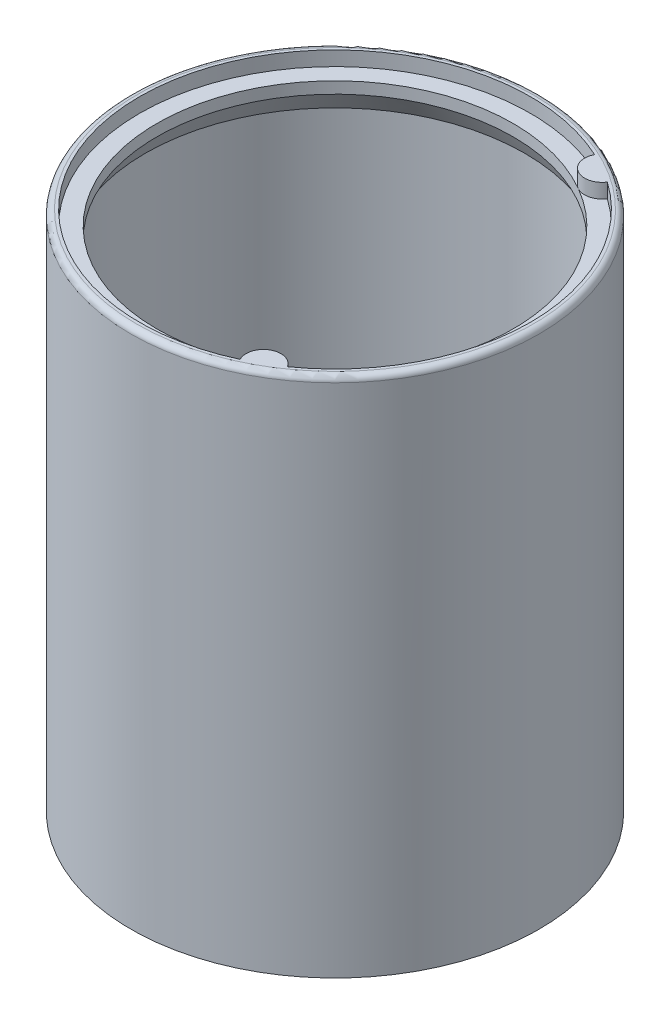
ISO-10303-21;
HEADER;
FILE_DESCRIPTION(('STEP AP214'),'2;1');
FILE_NAME('part.step','',(''),(''),'','','');
FILE_SCHEMA(('AUTOMOTIVE_DESIGN { 1 0 10303 214 1 1 1 1 }'));
ENDSEC;
DATA;
#1=APPLICATION_CONTEXT('core data for automotive mechanical design processes');
#2=APPLICATION_PROTOCOL_DEFINITION('international standard','automotive_design',2000,#1);
#3=PRODUCT_CONTEXT('',#1,'mechanical');
#4=PRODUCT('Part','Part','',(#3));
#5=PRODUCT_RELATED_PRODUCT_CATEGORY('part','',(#4));
#6=PRODUCT_DEFINITION_FORMATION('','',#4);
#7=PRODUCT_DEFINITION_CONTEXT('part definition',#1,'design');
#8=PRODUCT_DEFINITION('design','',#6,#7);
#9=PRODUCT_DEFINITION_SHAPE('','',#8);
#10=(LENGTH_UNIT() NAMED_UNIT(*) SI_UNIT(.MILLI.,.METRE.));
#11=(NAMED_UNIT(*) PLANE_ANGLE_UNIT() SI_UNIT($,.RADIAN.));
#12=(NAMED_UNIT(*) SI_UNIT($,.STERADIAN.) SOLID_ANGLE_UNIT());
#13=UNCERTAINTY_MEASURE_WITH_UNIT(LENGTH_MEASURE(1.E-05),#10,'distance_accuracy_value','');
#14=(GEOMETRIC_REPRESENTATION_CONTEXT(3) GLOBAL_UNCERTAINTY_ASSIGNED_CONTEXT((#13)) GLOBAL_UNIT_ASSIGNED_CONTEXT((#10,
#11,#12)) REPRESENTATION_CONTEXT('',''));
#15=CARTESIAN_POINT('',(0.,0.,0.));
#16=DIRECTION('',(0.,0.,1.));
#17=DIRECTION('',(1.,0.,0.));
#18=AXIS2_PLACEMENT_3D('',#15,#16,#17);
#19=CARTESIAN_POINT('',(0.,87.5,0.));
#20=DIRECTION('',(0.,1.,0.));
#21=DIRECTION('',(0.,0.,1.));
#22=AXIS2_PLACEMENT_3D('',#19,#20,#21);
#23=CYLINDRICAL_SURFACE('',#22,33.75);
#24=CARTESIAN_POINT('',(0.,87.5,0.));
#25=DIRECTION('',(0.,1.,0.));
#26=DIRECTION('',(0.,0.,1.));
#27=AXIS2_PLACEMENT_3D('',#24,#25,#26);
#28=CIRCLE('',#27,33.75);
#29=CARTESIAN_POINT('',(19.4038422750758,87.5,27.6143695376878));
#30=VERTEX_POINT('',#29);
#31=CARTESIAN_POINT('',(19.4038422750762,87.5,-27.6143695376875));
#32=VERTEX_POINT('',#31);
#33=EDGE_CURVE('E101',#30,#32,#28,.T.);
#34=ORIENTED_EDGE('',*,*,#33,.F.);
#35=DIRECTION('',(0.,-1.,0.));
#36=VECTOR('',#35,1.);
#37=CARTESIAN_POINT('',(19.4038422750758,90.,27.6143695376878));
#38=LINE('',#37,#36);
#39=CARTESIAN_POINT('',(19.4038422750758,90.,27.6143695376878));
#40=VERTEX_POINT('',#39);
#41=EDGE_CURVE('E58',#40,#30,#38,.T.);
#42=ORIENTED_EDGE('',*,*,#41,.F.);
#43=CARTESIAN_POINT('',(0.,90.,0.));
#44=DIRECTION('',(0.,1.,0.));
#45=DIRECTION('',(0.,0.,1.));
#46=AXIS2_PLACEMENT_3D('',#43,#44,#45);
#47=CIRCLE('',#46,33.75);
#48=CARTESIAN_POINT('',(19.4038422750762,90.,-27.6143695376875));
#49=VERTEX_POINT('',#48);
#50=EDGE_CURVE('E133',#40,#49,#47,.T.);
#51=ORIENTED_EDGE('',*,*,#50,.T.);
#52=DIRECTION('',(0.,-1.,0.));
#53=VECTOR('',#52,1.);
#54=CARTESIAN_POINT('',(19.4038422750762,90.,-27.6143695376875));
#55=LINE('',#54,#53);
#56=EDGE_CURVE('E127',#49,#32,#55,.T.);
#57=ORIENTED_EDGE('',*,*,#56,.T.);
#58=EDGE_LOOP('',(#34,#42,#51,#57));
#59=FACE_BOUND('',#58,.T.);
#60=ADVANCED_FACE('F43',(#59),#23,.F.);
#61=CARTESIAN_POINT('',(0.,87.5,0.));
#62=DIRECTION('',(0.,1.,0.));
#63=DIRECTION('',(0.,0.,1.));
#64=AXIS2_PLACEMENT_3D('',#61,#62,#63);
#65=PLANE('',#64);
#66=CARTESIAN_POINT('',(16.8749999999997,87.5,29.228357377725));
#67=DIRECTION('',(0.,1.,0.));
#68=DIRECTION('',(0.,0.,1.));
#69=AXIS2_PLACEMENT_3D('',#66,#67,#68);
#70=CIRCLE('',#69,3.);
#71=CARTESIAN_POINT('',(15.3749999999998,87.5,26.6302811663716));
#72=VERTEX_POINT('',#71);
#73=EDGE_CURVE('E111',#72,#30,#70,.F.);
#74=ORIENTED_EDGE('',*,*,#73,.T.);
#75=ORIENTED_EDGE('',*,*,#33,.T.);
#76=CARTESIAN_POINT('',(16.8750000000001,87.5,-29.2283573777247));
#77=DIRECTION('',(0.,1.,0.));
#78=DIRECTION('',(0.,0.,1.));
#79=AXIS2_PLACEMENT_3D('',#76,#77,#78);
#80=CIRCLE('',#79,3.);
#81=CARTESIAN_POINT('',(15.3750000000001,87.5,-26.6302811663714));
#82=VERTEX_POINT('',#81);
#83=EDGE_CURVE('E123',#32,#82,#80,.F.);
#84=ORIENTED_EDGE('',*,*,#83,.T.);
#85=CARTESIAN_POINT('',(0.,87.5,0.));
#86=DIRECTION('',(0.,1.,0.));
#87=DIRECTION('',(0.,0.,1.));
#88=AXIS2_PLACEMENT_3D('',#85,#86,#87);
#89=CIRCLE('',#88,30.75);
#90=EDGE_CURVE('E130',#72,#82,#89,.T.);
#91=ORIENTED_EDGE('',*,*,#90,.F.);
#92=EDGE_LOOP('',(#74,#75,#84,#91));
#93=FACE_BOUND('',#92,.T.);
#94=ADVANCED_FACE('F184',(#93),#65,.T.);
#95=CARTESIAN_POINT('',(0.,90.,0.));
#96=DIRECTION('',(0.,-1.,0.));
#97=DIRECTION('',(0.,0.,-1.));
#98=AXIS2_PLACEMENT_3D('',#95,#96,#97);
#99=CYLINDRICAL_SURFACE('',#98,35.25);
#100=CARTESIAN_POINT('',(0.,89.,0.));
#101=DIRECTION('',(0.,1.,0.));
#102=DIRECTION('',(0.,0.,1.));
#103=AXIS2_PLACEMENT_3D('',#100,#101,#102);
#104=CIRCLE('',#103,35.25);
#105=CARTESIAN_POINT('',(0.,89.,-35.25));
#106=VERTEX_POINT('',#105);
#107=EDGE_CURVE('E141',#106,#106,#104,.F.);
#108=CARTESIAN_POINT('',(0.,0.,0.));
#109=DIRECTION('',(0.,1.,0.));
#110=DIRECTION('',(0.,0.,1.));
#111=AXIS2_PLACEMENT_3D('',#108,#109,#110);
#112=CIRCLE('',#111,35.25);
#113=CARTESIAN_POINT('',(0.,0.,-35.25));
#114=VERTEX_POINT('',#113);
#115=EDGE_CURVE('E100',#114,#114,#112,.T.);
#116=CARTESIAN_POINT('',(0.,89.,-35.25));
#117=CARTESIAN_POINT('',(0.,88.0729166666667,-35.25));
#118=CARTESIAN_POINT('',(0.,87.1458333333333,-35.25));
#119=CARTESIAN_POINT('',(0.,85.2916666666667,-35.25));
#120=CARTESIAN_POINT('',(0.,84.3645833333333,-35.25));
#121=CARTESIAN_POINT('',(0.,82.5104166666667,-35.25));
#122=CARTESIAN_POINT('',(0.,81.5833333333333,-35.25));
#123=CARTESIAN_POINT('',(0.,79.7291666666667,-35.25));
#124=CARTESIAN_POINT('',(0.,78.8020833333333,-35.25));
#125=CARTESIAN_POINT('',(0.,76.9479166666667,-35.25));
#126=CARTESIAN_POINT('',(0.,76.0208333333333,-35.25));
#127=CARTESIAN_POINT('',(0.,74.1666666666667,-35.25));
#128=CARTESIAN_POINT('',(0.,73.2395833333333,-35.25));
#129=CARTESIAN_POINT('',(0.,71.3854166666667,-35.25));
#130=CARTESIAN_POINT('',(0.,70.4583333333333,-35.25));
#131=CARTESIAN_POINT('',(0.,68.6041666666667,-35.25));
#132=CARTESIAN_POINT('',(0.,67.6770833333333,-35.25));
#133=CARTESIAN_POINT('',(0.,65.8229166666667,-35.25));
#134=CARTESIAN_POINT('',(0.,64.8958333333333,-35.25));
#135=CARTESIAN_POINT('',(0.,63.0416666666667,-35.25));
#136=CARTESIAN_POINT('',(0.,62.1145833333333,-35.25));
#137=CARTESIAN_POINT('',(0.,60.2604166666667,-35.25));
#138=CARTESIAN_POINT('',(0.,59.3333333333333,-35.25));
#139=CARTESIAN_POINT('',(0.,57.4791666666667,-35.25));
#140=CARTESIAN_POINT('',(0.,56.5520833333333,-35.25));
#141=CARTESIAN_POINT('',(0.,54.6979166666667,-35.25));
#142=CARTESIAN_POINT('',(0.,53.7708333333333,-35.25));
#143=CARTESIAN_POINT('',(0.,51.9166666666667,-35.25));
#144=CARTESIAN_POINT('',(0.,50.9895833333333,-35.25));
#145=CARTESIAN_POINT('',(0.,49.1354166666667,-35.25));
#146=CARTESIAN_POINT('',(0.,48.2083333333333,-35.25));
#147=CARTESIAN_POINT('',(0.,46.3541666666667,-35.25));
#148=CARTESIAN_POINT('',(0.,45.4270833333333,-35.25));
#149=CARTESIAN_POINT('',(0.,43.5729166666667,-35.25));
#150=CARTESIAN_POINT('',(0.,42.6458333333333,-35.25));
#151=CARTESIAN_POINT('',(0.,40.7916666666667,-35.25));
#152=CARTESIAN_POINT('',(0.,39.8645833333333,-35.25));
#153=CARTESIAN_POINT('',(0.,38.0104166666667,-35.25));
#154=CARTESIAN_POINT('',(0.,37.0833333333333,-35.25));
#155=CARTESIAN_POINT('',(0.,35.2291666666667,-35.25));
#156=CARTESIAN_POINT('',(0.,34.3020833333333,-35.25));
#157=CARTESIAN_POINT('',(0.,32.4479166666667,-35.25));
#158=CARTESIAN_POINT('',(0.,31.5208333333333,-35.25));
#159=CARTESIAN_POINT('',(0.,29.6666666666667,-35.25));
#160=CARTESIAN_POINT('',(0.,28.7395833333333,-35.25));
#161=CARTESIAN_POINT('',(0.,26.8854166666667,-35.25));
#162=CARTESIAN_POINT('',(0.,25.9583333333333,-35.25));
#163=CARTESIAN_POINT('',(0.,24.1041666666667,-35.25));
#164=CARTESIAN_POINT('',(0.,23.1770833333333,-35.25));
#165=CARTESIAN_POINT('',(0.,21.3229166666667,-35.25));
#166=CARTESIAN_POINT('',(0.,20.3958333333333,-35.25));
#167=CARTESIAN_POINT('',(0.,18.5416666666667,-35.25));
#168=CARTESIAN_POINT('',(0.,17.6145833333333,-35.25));
#169=CARTESIAN_POINT('',(0.,15.7604166666667,-35.25));
#170=CARTESIAN_POINT('',(0.,14.8333333333333,-35.25));
#171=CARTESIAN_POINT('',(0.,12.9791666666666,-35.25));
#172=CARTESIAN_POINT('',(0.,12.0520833333333,-35.25));
#173=CARTESIAN_POINT('',(0.,10.1979166666666,-35.25));
#174=CARTESIAN_POINT('',(0.,9.27083333333332,-35.25));
#175=CARTESIAN_POINT('',(0.,7.41666666666665,-35.25));
#176=CARTESIAN_POINT('',(0.,6.48958333333332,-35.25));
#177=CARTESIAN_POINT('',(0.,4.63541666666665,-35.25));
#178=CARTESIAN_POINT('',(0.,3.70833333333332,-35.25));
#179=CARTESIAN_POINT('',(0.,1.85416666666665,-35.25));
#180=CARTESIAN_POINT('',(0.,0.92708333333332,-35.25));
#181=CARTESIAN_POINT('',(0.,0.,-35.25));
#182=B_SPLINE_CURVE_WITH_KNOTS('',3,(#116,#117,#118,#119,#120,#121,#122,#123,#124,#125,#126,
#127,#128,#129,#130,#131,#132,#133,#134,#135,#136,#137,#138,#139,#140,#141,#142,#143,#144,#145,
#146,#147,#148,#149,#150,#151,#152,#153,#154,#155,#156,#157,#158,#159,#160,#161,#162,#163,#164,
#165,#166,#167,#168,#169,#170,#171,#172,#173,#174,#175,#176,#177,#178,#179,#180,#181),
.UNSPECIFIED.,.F.,.F.,(4,2,2,2,2,2,2,2,2,2,2,2,2,2,2,2,2,2,2,2,2,2,2,2,2,2,2,2,2,2,2,2,4),(0.,
2.78125,5.5625,8.34375,11.125,13.90625,16.6875,19.46875,22.25,25.03125,27.8125,30.59375,33.375,
36.15625,38.9375,41.71875,44.5,47.28125,50.0625,52.84375,55.625,58.40625,61.1875,63.96875,66.75,
69.53125,72.3125,75.09375,77.875,80.65625,83.4375,86.21875,89.),.UNSPECIFIED.);
#183=EDGE_CURVE('BSEAM189',#106,#114,#182,.T.);
#184=ORIENTED_EDGE('',*,*,#107,.T.);
#185=ORIENTED_EDGE('',*,*,#115,.T.);
#186=ORIENTED_EDGE('',*,*,#183,.T.);
#187=ORIENTED_EDGE('',*,*,#183,.F.);
#188=EDGE_LOOP('',(#184,#186,#185,#187));
#189=FACE_BOUND('',#188,.T.);
#190=ADVANCED_FACE('F189',(#189),#99,.T.);
#191=CARTESIAN_POINT('',(0.,90.,0.));
#192=DIRECTION('',(0.,1.,0.));
#193=DIRECTION('',(0.,0.,1.));
#194=AXIS2_PLACEMENT_3D('',#191,#192,#193);
#195=PLANE('',#194);
#196=CARTESIAN_POINT('',(14.2128243915907,90.,-30.6114051100861));
#197=VERTEX_POINT('',#196);
#198=CARTESIAN_POINT('',(14.2128243915903,90.,30.6114051100863));
#199=VERTEX_POINT('',#198);
#200=EDGE_CURVE('E66',#197,#199,#47,.T.);
#201=ORIENTED_EDGE('',*,*,#200,.F.);
#202=CARTESIAN_POINT('',(16.8750000000001,90.,-29.2283573777247));
#203=DIRECTION('',(0.,1.,0.));
#204=DIRECTION('',(0.,0.,1.));
#205=AXIS2_PLACEMENT_3D('',#202,#203,#204);
#206=CIRCLE('',#205,3.);
#207=EDGE_CURVE('E119',#49,#197,#206,.F.);
#208=ORIENTED_EDGE('',*,*,#207,.F.);
#209=ORIENTED_EDGE('',*,*,#50,.F.);
#210=CARTESIAN_POINT('',(16.8749999999997,90.,29.228357377725));
#211=DIRECTION('',(0.,1.,0.));
#212=DIRECTION('',(0.,0.,1.));
#213=AXIS2_PLACEMENT_3D('',#210,#211,#212);
#214=CIRCLE('',#213,3.);
#215=EDGE_CURVE('E112',#199,#40,#214,.F.);
#216=ORIENTED_EDGE('',*,*,#215,.F.);
#217=EDGE_LOOP('',(#201,#208,#209,#216));
#218=FACE_BOUND('',#217,.T.);
#219=CARTESIAN_POINT('',(0.,90.,0.));
#220=DIRECTION('',(0.,1.,0.));
#221=DIRECTION('',(0.,0.,1.));
#222=AXIS2_PLACEMENT_3D('',#219,#220,#221);
#223=CIRCLE('',#222,34.25);
#224=CARTESIAN_POINT('',(0.,90.,34.25));
#225=VERTEX_POINT('',#224);
#226=EDGE_CURVE('E138',#225,#225,#223,.T.);
#227=ORIENTED_EDGE('',*,*,#226,.T.);
#228=EDGE_LOOP('',(#227));
#229=FACE_BOUND('',#228,.T.);
#230=ADVANCED_FACE('F206',(#218,#229),#195,.T.);
#231=CARTESIAN_POINT('',(0.,0.,0.));
#232=DIRECTION('',(0.,1.,0.));
#233=DIRECTION('',(0.,0.,1.));
#234=AXIS2_PLACEMENT_3D('',#231,#232,#233);
#235=PLANE('',#234);
#236=CARTESIAN_POINT('',(0.,0.,0.));
#237=DIRECTION('',(0.,-1.,0.));
#238=DIRECTION('',(0.,0.,-1.));
#239=AXIS2_PLACEMENT_3D('',#236,#237,#238);
#240=CIRCLE('',#239,3.2);
#241=CARTESIAN_POINT('',(0.,0.,-3.2));
#242=VERTEX_POINT('',#241);
#243=EDGE_CURVE('E153',#242,#242,#240,.T.);
#244=ORIENTED_EDGE('',*,*,#243,.F.);
#245=EDGE_LOOP('',(#244));
#246=FACE_BOUND('',#245,.T.);
#247=ORIENTED_EDGE('',*,*,#115,.F.);
#248=EDGE_LOOP('',(#247));
#249=FACE_BOUND('',#248,.T.);
#250=ADVANCED_FACE('F200',(#246,#249),#235,.F.);
#251=CARTESIAN_POINT('',(0.,89.,0.));
#252=DIRECTION('',(0.,1.,0.));
#253=DIRECTION('',(0.,0.,1.));
#254=AXIS2_PLACEMENT_3D('',#251,#252,#253);
#255=TOROIDAL_SURFACE('',#254,34.25,1.);
#256=ORIENTED_EDGE('',*,*,#107,.F.);
#257=EDGE_LOOP('',(#256));
#258=FACE_BOUND('',#257,.T.);
#259=ORIENTED_EDGE('',*,*,#226,.F.);
#260=EDGE_LOOP('',(#259));
#261=FACE_BOUND('',#260,.T.);
#262=ADVANCED_FACE('F194',(#258,#261),#255,.T.);
#263=ORIENTED_EDGE('',*,*,#200,.T.);
#264=DIRECTION('',(0.,-1.,0.));
#265=VECTOR('',#264,1.);
#266=CARTESIAN_POINT('',(14.2128243915903,90.,30.6114051100863));
#267=LINE('',#266,#265);
#268=CARTESIAN_POINT('',(14.2128243915903,87.5,30.6114051100863));
#269=VERTEX_POINT('',#268);
#270=EDGE_CURVE('E103',#199,#269,#267,.T.);
#271=ORIENTED_EDGE('',*,*,#270,.T.);
#272=CARTESIAN_POINT('',(14.2128243915907,87.5,-30.6114051100861));
#273=VERTEX_POINT('',#272);
#274=EDGE_CURVE('E91',#273,#269,#28,.T.);
#275=ORIENTED_EDGE('',*,*,#274,.F.);
#276=DIRECTION('',(0.,-1.,0.));
#277=VECTOR('',#276,1.);
#278=CARTESIAN_POINT('',(14.2128243915907,90.,-30.6114051100861));
#279=LINE('',#278,#277);
#280=EDGE_CURVE('E122',#197,#273,#279,.T.);
#281=ORIENTED_EDGE('',*,*,#280,.F.);
#282=EDGE_LOOP('',(#263,#271,#275,#281));
#283=FACE_BOUND('',#282,.T.);
#284=ADVANCED_FACE('F104',(#283),#23,.F.);
#285=EDGE_CURVE('E95',#269,#72,#70,.F.);
#286=ORIENTED_EDGE('',*,*,#285,.T.);
#287=EDGE_CURVE('E131',#82,#72,#89,.T.);
#288=ORIENTED_EDGE('',*,*,#287,.F.);
#289=EDGE_CURVE('E98',#82,#273,#80,.F.);
#290=ORIENTED_EDGE('',*,*,#289,.T.);
#291=ORIENTED_EDGE('',*,*,#274,.T.);
#292=EDGE_LOOP('',(#286,#288,#290,#291));
#293=FACE_BOUND('',#292,.T.);
#294=ADVANCED_FACE('F92',(#293),#65,.T.);
#295=CARTESIAN_POINT('',(0.,77.5,0.));
#296=DIRECTION('',(0.,1.,0.));
#297=DIRECTION('',(0.,0.,1.));
#298=AXIS2_PLACEMENT_3D('',#295,#296,#297);
#299=CYLINDRICAL_SURFACE('',#298,30.75);
#300=CARTESIAN_POINT('',(0.,85.5,0.));
#301=DIRECTION('',(0.,1.,0.));
#302=DIRECTION('',(0.,0.,1.));
#303=AXIS2_PLACEMENT_3D('',#300,#301,#302);
#304=CIRCLE('',#303,30.75);
#305=CARTESIAN_POINT('',(0.,85.5,30.75));
#306=VERTEX_POINT('',#305);
#307=EDGE_CURVE('E144',#306,#306,#304,.F.);
#308=ORIENTED_EDGE('',*,*,#307,.T.);
#309=EDGE_LOOP('',(#308));
#310=FACE_BOUND('',#309,.T.);
#311=ORIENTED_EDGE('',*,*,#287,.T.);
#312=ORIENTED_EDGE('',*,*,#90,.T.);
#313=EDGE_LOOP('',(#311,#312));
#314=FACE_BOUND('',#313,.T.);
#315=ADVANCED_FACE('F199',(#310,#314),#299,.F.);
#316=CARTESIAN_POINT('',(0.,3.49999999999999,0.));
#317=DIRECTION('',(0.,1.,0.));
#318=DIRECTION('',(0.,0.,1.));
#319=AXIS2_PLACEMENT_3D('',#316,#317,#318);
#320=PLANE('',#319);
#321=CARTESIAN_POINT('',(0.,3.49999999999999,0.));
#322=DIRECTION('',(0.,1.,0.));
#323=DIRECTION('',(0.,0.,1.));
#324=AXIS2_PLACEMENT_3D('',#321,#322,#323);
#325=CIRCLE('',#324,7.7);
#326=CARTESIAN_POINT('',(0.,3.49999999999999,7.7));
#327=VERTEX_POINT('',#326);
#328=EDGE_CURVE('E162',#327,#327,#325,.F.);
#329=ORIENTED_EDGE('',*,*,#328,.T.);
#330=EDGE_LOOP('',(#329));
#331=FACE_BOUND('',#330,.T.);
#332=CARTESIAN_POINT('',(0.,3.49999999999999,0.));
#333=DIRECTION('',(0.,1.,0.));
#334=DIRECTION('',(0.,0.,1.));
#335=AXIS2_PLACEMENT_3D('',#332,#333,#334);
#336=CIRCLE('',#335,31.25);
#337=CARTESIAN_POINT('',(0.,3.49999999999999,31.25));
#338=VERTEX_POINT('',#337);
#339=EDGE_CURVE('E159',#338,#338,#336,.T.);
#340=ORIENTED_EDGE('',*,*,#339,.T.);
#341=EDGE_LOOP('',(#340));
#342=FACE_BOUND('',#341,.T.);
#343=ADVANCED_FACE('F228',(#331,#342),#320,.T.);
#344=CARTESIAN_POINT('',(0.,3.49999999999999,0.));
#345=DIRECTION('',(0.,1.,0.));
#346=DIRECTION('',(0.,0.,1.));
#347=AXIS2_PLACEMENT_3D('',#344,#345,#346);
#348=CYLINDRICAL_SURFACE('',#347,32.75);
#349=CARTESIAN_POINT('',(0.,4.99999999999999,0.));
#350=DIRECTION('',(0.,1.,0.));
#351=DIRECTION('',(0.,0.,1.));
#352=AXIS2_PLACEMENT_3D('',#349,#350,#351);
#353=CIRCLE('',#352,32.75);
#354=CARTESIAN_POINT('',(0.,4.99999999999999,32.75));
#355=VERTEX_POINT('',#354);
#356=EDGE_CURVE('E11',#355,#355,#353,.F.);
#357=CARTESIAN_POINT('',(0.,82.0358983848623,0.));
#358=DIRECTION('',(0.,-1.,0.));
#359=DIRECTION('',(0.,0.,-1.));
#360=AXIS2_PLACEMENT_3D('',#357,#358,#359);
#361=CIRCLE('',#360,32.75);
#362=CARTESIAN_POINT('',(0.,82.0358983848624,32.75));
#363=VERTEX_POINT('',#362);
#364=EDGE_CURVE('E147',#363,#363,#361,.F.);
#365=CARTESIAN_POINT('',(0.,4.99999999999999,32.75));
#366=CARTESIAN_POINT('',(0.,5.8024572748423,32.75));
#367=CARTESIAN_POINT('',(0.,6.60491454968462,32.75));
#368=CARTESIAN_POINT('',(0.,8.20982909936926,32.75));
#369=CARTESIAN_POINT('',(0.,9.01228637421157,32.75));
#370=CARTESIAN_POINT('',(0.,10.6172009238962,32.75));
#371=CARTESIAN_POINT('',(0.,11.4196581987385,32.75));
#372=CARTESIAN_POINT('',(0.,13.0245727484232,32.75));
#373=CARTESIAN_POINT('',(0.,13.8270300232655,32.75));
#374=CARTESIAN_POINT('',(0.,15.4319445729501,32.75));
#375=CARTESIAN_POINT('',(0.,16.2344018477924,32.75));
#376=CARTESIAN_POINT('',(0.,17.839316397477,32.75));
#377=CARTESIAN_POINT('',(0.,18.6417736723194,32.75));
#378=CARTESIAN_POINT('',(0.,20.246688222004,32.75));
#379=CARTESIAN_POINT('',(0.,21.0491454968463,32.75));
#380=CARTESIAN_POINT('',(0.,22.6540600465309,32.75));
#381=CARTESIAN_POINT('',(0.,23.4565173213733,32.75));
#382=CARTESIAN_POINT('',(0.,25.0614318710579,32.75));
#383=CARTESIAN_POINT('',(0.,25.8638891459002,32.75));
#384=CARTESIAN_POINT('',(0.,27.4688036955848,32.75));
#385=CARTESIAN_POINT('',(0.,28.2712609704272,32.75));
#386=CARTESIAN_POINT('',(0.,29.8761755201118,32.75));
#387=CARTESIAN_POINT('',(0.,30.6786327949541,32.75));
#388=CARTESIAN_POINT('',(0.,32.2835473446387,32.75));
#389=CARTESIAN_POINT('',(0.,33.0860046194811,32.75));
#390=CARTESIAN_POINT('',(0.,34.6909191691657,32.75));
#391=CARTESIAN_POINT('',(0.,35.493376444008,32.75));
#392=CARTESIAN_POINT('',(0.,37.0982909936926,32.75));
#393=CARTESIAN_POINT('',(0.,37.900748268535,32.75));
#394=CARTESIAN_POINT('',(0.,39.5056628182196,32.75));
#395=CARTESIAN_POINT('',(0.,40.3081200930619,32.75));
#396=CARTESIAN_POINT('',(0.,41.9130346427465,32.75));
#397=CARTESIAN_POINT('',(0.,42.7154919175889,32.75));
#398=CARTESIAN_POINT('',(0.,44.3204064672735,32.75));
#399=CARTESIAN_POINT('',(0.,45.1228637421158,32.75));
#400=CARTESIAN_POINT('',(0.,46.7277782918004,32.75));
#401=CARTESIAN_POINT('',(0.,47.5302355666428,32.75));
#402=CARTESIAN_POINT('',(0.,49.1351501163274,32.75));
#403=CARTESIAN_POINT('',(0.,49.9376073911697,32.75));
#404=CARTESIAN_POINT('',(0.,51.5425219408543,32.75));
#405=CARTESIAN_POINT('',(0.,52.3449792156967,32.75));
#406=CARTESIAN_POINT('',(0.,53.9498937653813,32.75));
#407=CARTESIAN_POINT('',(0.,54.7523510402236,32.75));
#408=CARTESIAN_POINT('',(0.,56.3572655899082,32.75));
#409=CARTESIAN_POINT('',(0.,57.1597228647506,32.75));
#410=CARTESIAN_POINT('',(0.,58.7646374144352,32.75));
#411=CARTESIAN_POINT('',(0.,59.5670946892775,32.75));
#412=CARTESIAN_POINT('',(0.,61.1720092389621,32.75));
#413=CARTESIAN_POINT('',(0.,61.9744665138045,32.75));
#414=CARTESIAN_POINT('',(0.,63.5793810634891,32.75));
#415=CARTESIAN_POINT('',(0.,64.3818383383314,32.75));
#416=CARTESIAN_POINT('',(0.,65.986752888016,32.75));
#417=CARTESIAN_POINT('',(0.,66.7892101628584,32.75));
#418=CARTESIAN_POINT('',(0.,68.394124712543,32.75));
#419=CARTESIAN_POINT('',(0.,69.1965819873853,32.75));
#420=CARTESIAN_POINT('',(0.,70.8014965370699,32.75));
#421=CARTESIAN_POINT('',(0.,71.6039538119122,32.75));
#422=CARTESIAN_POINT('',(0.,73.2088683615969,32.75));
#423=CARTESIAN_POINT('',(0.,74.0113256364392,32.75));
#424=CARTESIAN_POINT('',(0.,75.6162401861238,32.75));
#425=CARTESIAN_POINT('',(0.,76.4186974609661,32.75));
#426=CARTESIAN_POINT('',(0.,78.0236120106508,32.75));
#427=CARTESIAN_POINT('',(0.,78.8260692854931,32.75));
#428=CARTESIAN_POINT('',(0.,80.4309838351777,32.75));
#429=CARTESIAN_POINT('',(0.,81.23344111002,32.75));
#430=CARTESIAN_POINT('',(0.,82.0358983848624,32.75));
#431=B_SPLINE_CURVE_WITH_KNOTS('',3,(#365,#366,#367,#368,#369,#370,#371,#372,#373,#374,#375,
#376,#377,#378,#379,#380,#381,#382,#383,#384,#385,#386,#387,#388,#389,#390,#391,#392,#393,#394,
#395,#396,#397,#398,#399,#400,#401,#402,#403,#404,#405,#406,#407,#408,#409,#410,#411,#412,#413,
#414,#415,#416,#417,#418,#419,#420,#421,#422,#423,#424,#425,#426,#427,#428,#429,#430),
.UNSPECIFIED.,.F.,.F.,(4,2,2,2,2,2,2,2,2,2,2,2,2,2,2,2,2,2,2,2,2,2,2,2,2,2,2,2,2,2,2,2,4),(0.,
2.40737182452695,4.8147436490539,7.22211547358085,9.6294872981078,12.0368591226347,
14.4442309471617,16.8516027716886,19.2589745962156,21.6663464207425,24.0737182452695,
26.4810900697964,28.8884618943234,31.2958337188503,33.7032055433773,36.1105773679042,
38.5179491924312,40.9253210169581,43.3326928414851,45.740064666012,48.147436490539,
50.5548083150659,52.9621801395929,55.3695519641198,57.7769237886468,60.1842956131737,
62.5916674377007,64.9990392622276,67.4064110867546,69.8137829112815,72.2211547358085,
74.6285265603354,77.0358983848624),.UNSPECIFIED.);
#432=EDGE_CURVE('BSEAM219',#355,#363,#431,.T.);
#433=ORIENTED_EDGE('',*,*,#356,.T.);
#434=ORIENTED_EDGE('',*,*,#364,.T.);
#435=ORIENTED_EDGE('',*,*,#432,.T.);
#436=ORIENTED_EDGE('',*,*,#432,.F.);
#437=EDGE_LOOP('',(#433,#435,#434,#436));
#438=FACE_BOUND('',#437,.T.);
#439=ADVANCED_FACE('F219',(#438),#348,.F.);
#440=CARTESIAN_POINT('',(0.,77.5,0.));
#441=DIRECTION('',(0.,-1.,0.));
#442=DIRECTION('',(0.,0.,-1.));
#443=AXIS2_PLACEMENT_3D('',#440,#441,#442);
#444=CONICAL_SURFACE('',#443,35.3688021535171,0.523598775598305);
#445=ORIENTED_EDGE('',*,*,#307,.F.);
#446=EDGE_LOOP('',(#445));
#447=FACE_BOUND('',#446,.T.);
#448=ORIENTED_EDGE('',*,*,#364,.F.);
#449=EDGE_LOOP('',(#448));
#450=FACE_BOUND('',#449,.T.);
#451=ADVANCED_FACE('F214',(#447,#450),#444,.F.);
#452=CARTESIAN_POINT('',(16.8750000000001,90.,-29.2283573777247));
#453=DIRECTION('',(0.,-1.,0.));
#454=DIRECTION('',(0.,0.,-1.));
#455=AXIS2_PLACEMENT_3D('',#452,#453,#454);
#456=CYLINDRICAL_SURFACE('',#455,3.);
#457=ORIENTED_EDGE('',*,*,#83,.F.);
#458=ORIENTED_EDGE('',*,*,#56,.F.);
#459=ORIENTED_EDGE('',*,*,#207,.T.);
#460=ORIENTED_EDGE('',*,*,#280,.T.);
#461=ORIENTED_EDGE('',*,*,#289,.F.);
#462=EDGE_LOOP('',(#457,#458,#459,#460,#461));
#463=FACE_BOUND('',#462,.T.);
#464=ADVANCED_FACE('F218',(#463),#456,.T.);
#465=CARTESIAN_POINT('',(16.8749999999997,90.,29.228357377725));
#466=DIRECTION('',(0.,-1.,0.));
#467=DIRECTION('',(0.,0.,-1.));
#468=AXIS2_PLACEMENT_3D('',#465,#466,#467);
#469=CYLINDRICAL_SURFACE('',#468,3.);
#470=ORIENTED_EDGE('',*,*,#285,.F.);
#471=ORIENTED_EDGE('',*,*,#270,.F.);
#472=ORIENTED_EDGE('',*,*,#215,.T.);
#473=ORIENTED_EDGE('',*,*,#41,.T.);
#474=ORIENTED_EDGE('',*,*,#73,.F.);
#475=EDGE_LOOP('',(#470,#471,#472,#473,#474));
#476=FACE_BOUND('',#475,.T.);
#477=ADVANCED_FACE('F110',(#476),#469,.T.);
#478=CARTESIAN_POINT('',(0.,11.5,0.));
#479=DIRECTION('',(0.,-1.,0.));
#480=DIRECTION('',(0.,0.,-1.));
#481=AXIS2_PLACEMENT_3D('',#478,#479,#480);
#482=CYLINDRICAL_SURFACE('',#481,6.2);
#483=CARTESIAN_POINT('',(0.,4.99999999999999,0.));
#484=DIRECTION('',(0.,1.,0.));
#485=DIRECTION('',(0.,0.,1.));
#486=AXIS2_PLACEMENT_3D('',#483,#484,#485);
#487=CIRCLE('',#486,6.2);
#488=CARTESIAN_POINT('',(0.,4.99999999999999,6.2));
#489=VERTEX_POINT('',#488);
#490=EDGE_CURVE('E156',#489,#489,#487,.T.);
#491=ORIENTED_EDGE('',*,*,#490,.T.);
#492=EDGE_LOOP('',(#491));
#493=FACE_BOUND('',#492,.T.);
#494=CARTESIAN_POINT('',(0.,9.99999999999999,0.));
#495=DIRECTION('',(0.,1.,0.));
#496=DIRECTION('',(0.,0.,1.));
#497=AXIS2_PLACEMENT_3D('',#494,#495,#496);
#498=CIRCLE('',#497,6.2);
#499=CARTESIAN_POINT('',(0.,9.99999999999999,6.2));
#500=VERTEX_POINT('',#499);
#501=EDGE_CURVE('E150',#500,#500,#498,.F.);
#502=ORIENTED_EDGE('',*,*,#501,.T.);
#503=EDGE_LOOP('',(#502));
#504=FACE_BOUND('',#503,.T.);
#505=ADVANCED_FACE('F303',(#493,#504),#482,.T.);
#506=CARTESIAN_POINT('',(0.,11.5,0.));
#507=DIRECTION('',(0.,1.,0.));
#508=DIRECTION('',(0.,0.,1.));
#509=AXIS2_PLACEMENT_3D('',#506,#507,#508);
#510=PLANE('',#509);
#511=CARTESIAN_POINT('',(0.,11.5,0.));
#512=DIRECTION('',(0.,1.,0.));
#513=DIRECTION('',(0.,0.,1.));
#514=AXIS2_PLACEMENT_3D('',#511,#512,#513);
#515=CIRCLE('',#514,4.7);
#516=CARTESIAN_POINT('',(0.,11.5,4.7));
#517=VERTEX_POINT('',#516);
#518=EDGE_CURVE('E51',#517,#517,#515,.T.);
#519=ORIENTED_EDGE('',*,*,#518,.T.);
#520=EDGE_LOOP('',(#519));
#521=FACE_BOUND('',#520,.T.);
#522=CARTESIAN_POINT('',(0.,11.5,0.));
#523=DIRECTION('',(0.,1.,0.));
#524=DIRECTION('',(0.,0.,1.));
#525=AXIS2_PLACEMENT_3D('',#522,#523,#524);
#526=CIRCLE('',#525,3.2);
#527=CARTESIAN_POINT('',(0.,11.5,-3.2));
#528=VERTEX_POINT('',#527);
#529=EDGE_CURVE('E115',#528,#528,#526,.T.);
#530=ORIENTED_EDGE('',*,*,#529,.F.);
#531=EDGE_LOOP('',(#530));
#532=FACE_BOUND('',#531,.T.);
#533=ADVANCED_FACE('F167',(#521,#532),#510,.T.);
#534=CARTESIAN_POINT('',(0.,90.,0.));
#535=DIRECTION('',(0.,-1.,0.));
#536=DIRECTION('',(0.,0.,-1.));
#537=AXIS2_PLACEMENT_3D('',#534,#535,#536);
#538=CYLINDRICAL_SURFACE('',#537,3.2);
#539=CARTESIAN_POINT('',(0.,11.5,-3.2));
#540=CARTESIAN_POINT('',(0.,11.3802083333333,-3.2));
#541=CARTESIAN_POINT('',(0.,11.2604166666666,-3.2));
#542=CARTESIAN_POINT('',(0.,11.0208333333333,-3.2));
#543=CARTESIAN_POINT('',(0.,10.9010416666666,-3.2));
#544=CARTESIAN_POINT('',(0.,10.6614583333333,-3.2));
#545=CARTESIAN_POINT('',(0.,10.5416666666666,-3.2));
#546=CARTESIAN_POINT('',(0.,10.3020833333333,-3.2));
#547=CARTESIAN_POINT('',(0.,10.1822916666666,-3.2));
#548=CARTESIAN_POINT('',(0.,9.94270833333331,-3.2));
#549=CARTESIAN_POINT('',(0.,9.82291666666664,-3.2));
#550=CARTESIAN_POINT('',(0.,9.58333333333331,-3.2));
#551=CARTESIAN_POINT('',(0.,9.46354166666664,-3.2));
#552=CARTESIAN_POINT('',(0.,9.2239583333333,-3.2));
#553=CARTESIAN_POINT('',(0.,9.10416666666664,-3.2));
#554=CARTESIAN_POINT('',(0.,8.86458333333331,-3.2));
#555=CARTESIAN_POINT('',(0.,8.74479166666664,-3.2));
#556=CARTESIAN_POINT('',(0.,8.50520833333331,-3.2));
#557=CARTESIAN_POINT('',(0.,8.38541666666665,-3.2));
#558=CARTESIAN_POINT('',(0.,8.14583333333332,-3.2));
#559=CARTESIAN_POINT('',(0.,8.02604166666666,-3.2));
#560=CARTESIAN_POINT('',(0.,7.78645833333332,-3.2));
#561=CARTESIAN_POINT('',(0.,7.66666666666665,-3.2));
#562=CARTESIAN_POINT('',(0.,7.42708333333332,-3.2));
#563=CARTESIAN_POINT('',(0.,7.30729166666665,-3.2));
#564=CARTESIAN_POINT('',(0.,7.06770833333332,-3.2));
#565=CARTESIAN_POINT('',(0.,6.94791666666666,-3.2));
#566=CARTESIAN_POINT('',(0.,6.70833333333332,-3.2));
#567=CARTESIAN_POINT('',(0.,6.58854166666665,-3.2));
#568=CARTESIAN_POINT('',(0.,6.34895833333332,-3.2));
#569=CARTESIAN_POINT('',(0.,6.22916666666665,-3.2));
#570=CARTESIAN_POINT('',(0.,5.98958333333332,-3.2));
#571=CARTESIAN_POINT('',(0.,5.86979166666666,-3.2));
#572=CARTESIAN_POINT('',(0.,5.63020833333333,-3.2));
#573=CARTESIAN_POINT('',(0.,5.51041666666666,-3.2));
#574=CARTESIAN_POINT('',(0.,5.27083333333333,-3.2));
#575=CARTESIAN_POINT('',(0.,5.15104166666667,-3.2));
#576=CARTESIAN_POINT('',(0.,4.91145833333333,-3.2));
#577=CARTESIAN_POINT('',(0.,4.79166666666666,-3.2));
#578=CARTESIAN_POINT('',(0.,4.55208333333333,-3.2));
#579=CARTESIAN_POINT('',(0.,4.43229166666666,-3.2));
#580=CARTESIAN_POINT('',(0.,4.19270833333333,-3.2));
#581=CARTESIAN_POINT('',(0.,4.07291666666667,-3.2));
#582=CARTESIAN_POINT('',(0.,3.83333333333333,-3.2));
#583=CARTESIAN_POINT('',(0.,3.71354166666666,-3.2));
#584=CARTESIAN_POINT('',(0.,3.47395833333333,-3.2));
#585=CARTESIAN_POINT('',(0.,3.35416666666666,-3.2));
#586=CARTESIAN_POINT('',(0.,3.11458333333333,-3.2));
#587=CARTESIAN_POINT('',(0.,2.99479166666667,-3.2));
#588=CARTESIAN_POINT('',(0.,2.75520833333334,-3.2));
#589=CARTESIAN_POINT('',(0.,2.63541666666667,-3.2));
#590=CARTESIAN_POINT('',(0.,2.39583333333334,-3.2));
#591=CARTESIAN_POINT('',(0.,2.27604166666668,-3.2));
#592=CARTESIAN_POINT('',(0.,2.03645833333334,-3.2));
#593=CARTESIAN_POINT('',(0.,1.91666666666667,-3.2));
#594=CARTESIAN_POINT('',(0.,1.67708333333334,-3.2));
#595=CARTESIAN_POINT('',(0.,1.55729166666667,-3.2));
#596=CARTESIAN_POINT('',(0.,1.31770833333334,-3.2));
#597=CARTESIAN_POINT('',(0.,1.19791666666668,-3.2));
#598=CARTESIAN_POINT('',(0.,0.958333333333343,-3.2));
#599=CARTESIAN_POINT('',(0.,0.838541666666674,-3.2));
#600=CARTESIAN_POINT('',(0.,0.598958333333339,-3.2));
#601=CARTESIAN_POINT('',(0.,0.479166666666674,-3.2));
#602=CARTESIAN_POINT('',(0.,0.239583333333344,-3.2));
#603=CARTESIAN_POINT('',(0.,0.119791666666679,-3.2));
#604=CARTESIAN_POINT('',(0.,0.,-3.2));
#605=B_SPLINE_CURVE_WITH_KNOTS('',3,(#539,#540,#541,#542,#543,#544,#545,#546,#547,#548,#549,
#550,#551,#552,#553,#554,#555,#556,#557,#558,#559,#560,#561,#562,#563,#564,#565,#566,#567,#568,
#569,#570,#571,#572,#573,#574,#575,#576,#577,#578,#579,#580,#581,#582,#583,#584,#585,#586,#587,
#588,#589,#590,#591,#592,#593,#594,#595,#596,#597,#598,#599,#600,#601,#602,#603,#604),
.UNSPECIFIED.,.F.,.F.,(4,2,2,2,2,2,2,2,2,2,2,2,2,2,2,2,2,2,2,2,2,2,2,2,2,2,2,2,2,2,2,2,4),(0.,
0.359374999999995,0.71874999999999,1.078125,1.43749999999999,1.79687499999999,2.15625,
2.51562499999999,2.87499999999999,3.23437499999998,3.59374999999998,3.95312499999999,
4.31249999999998,4.67187499999998,5.03124999999999,5.39062499999998,5.74999999999998,
6.10937499999997,6.46874999999997,6.82812499999998,7.18749999999997,7.54687499999997,
7.90624999999998,8.26562499999997,8.62499999999997,8.98437499999996,9.34374999999996,
9.70312499999996,10.0625,10.421875,10.78125,11.140625,11.5),.UNSPECIFIED.);
#606=EDGE_CURVE('BSEAM179',#528,#242,#605,.T.);
#607=ORIENTED_EDGE('',*,*,#529,.T.);
#608=ORIENTED_EDGE('',*,*,#243,.T.);
#609=ORIENTED_EDGE('',*,*,#606,.T.);
#610=ORIENTED_EDGE('',*,*,#606,.F.);
#611=EDGE_LOOP('',(#607,#609,#608,#610));
#612=FACE_BOUND('',#611,.T.);
#613=ADVANCED_FACE('F179',(#612),#538,.F.);
#614=CARTESIAN_POINT('',(0.,4.99999999999999,0.));
#615=DIRECTION('',(0.,1.,0.));
#616=DIRECTION('',(0.,0.,1.));
#617=AXIS2_PLACEMENT_3D('',#614,#615,#616);
#618=TOROIDAL_SURFACE('',#617,7.7,1.5);
#619=ORIENTED_EDGE('',*,*,#328,.F.);
#620=EDGE_LOOP('',(#619));
#621=FACE_BOUND('',#620,.T.);
#622=ORIENTED_EDGE('',*,*,#490,.F.);
#623=EDGE_LOOP('',(#622));
#624=FACE_BOUND('',#623,.T.);
#625=ADVANCED_FACE('F172',(#621,#624),#618,.F.);
#626=CARTESIAN_POINT('',(0.,9.99999999999999,0.));
#627=DIRECTION('',(0.,1.,0.));
#628=DIRECTION('',(0.,0.,1.));
#629=AXIS2_PLACEMENT_3D('',#626,#627,#628);
#630=TOROIDAL_SURFACE('',#629,4.7,1.5);
#631=ORIENTED_EDGE('',*,*,#501,.F.);
#632=EDGE_LOOP('',(#631));
#633=FACE_BOUND('',#632,.T.);
#634=ORIENTED_EDGE('',*,*,#518,.F.);
#635=EDGE_LOOP('',(#634));
#636=FACE_BOUND('',#635,.T.);
#637=ADVANCED_FACE('F170',(#633,#636),#630,.T.);
#638=CARTESIAN_POINT('',(0.,4.99999999999999,0.));
#639=DIRECTION('',(0.,1.,0.));
#640=DIRECTION('',(0.,0.,1.));
#641=AXIS2_PLACEMENT_3D('',#638,#639,#640);
#642=TOROIDAL_SURFACE('',#641,31.25,1.5);
#643=ORIENTED_EDGE('',*,*,#356,.F.);
#644=EDGE_LOOP('',(#643));
#645=FACE_BOUND('',#644,.T.);
#646=ORIENTED_EDGE('',*,*,#339,.F.);
#647=EDGE_LOOP('',(#646));
#648=FACE_BOUND('',#647,.T.);
#649=ADVANCED_FACE('F45',(#645,#648),#642,.F.);
#650=CLOSED_SHELL('',(#60,#94,#190,#230,#250,#262,#284,#294,#315,#343,#439,#451,#464,#477,#505,
#533,#613,#625,#637,#649));
#651=MANIFOLD_SOLID_BREP('B2',#650);
#652=ADVANCED_BREP_SHAPE_REPRESENTATION('',(#18,#651),#14);
#653=SHAPE_DEFINITION_REPRESENTATION(#9,#652);
ENDSEC;
END-ISO-10303-21;
